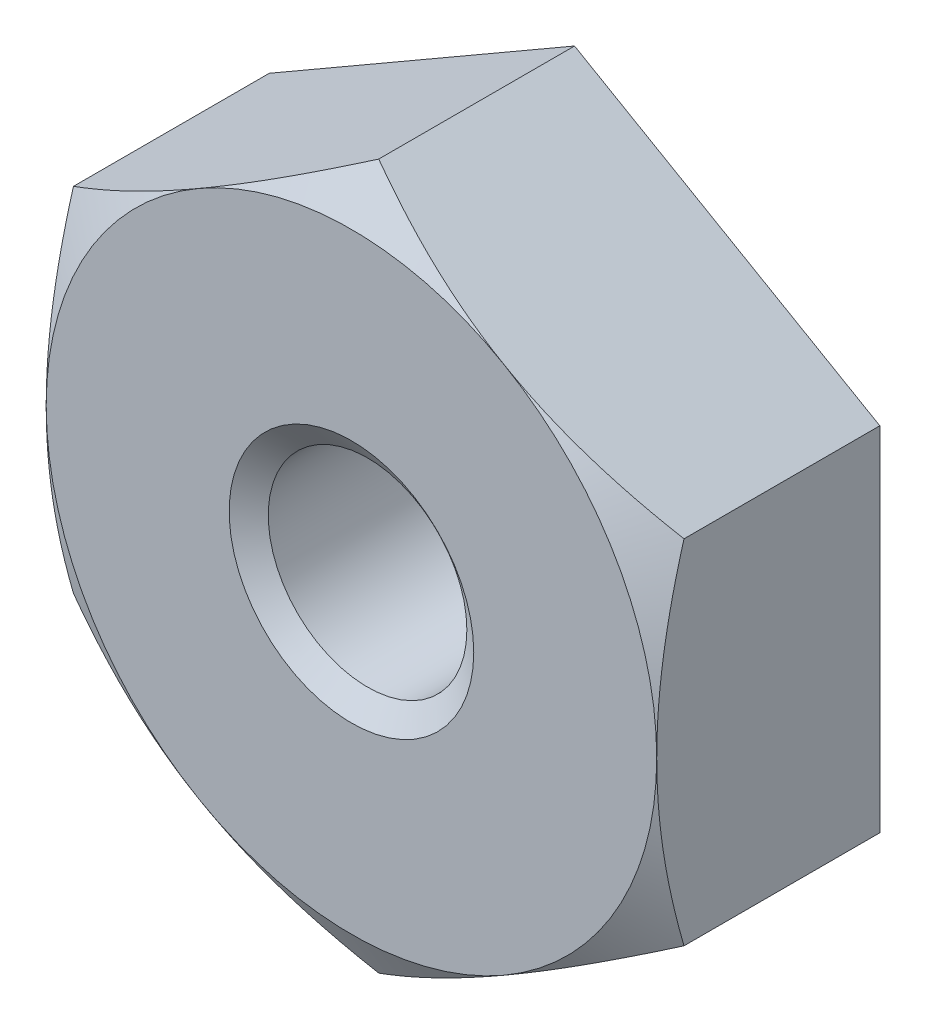
ISO-10303-21;
HEADER;
FILE_DESCRIPTION(('STEP AP214'),'2;1');
FILE_NAME('part.step','',(''),(''),'','','');
FILE_SCHEMA(('AUTOMOTIVE_DESIGN { 1 0 10303 214 1 1 1 1 }'));
ENDSEC;
DATA;
#1=APPLICATION_CONTEXT('core data for automotive mechanical design processes');
#2=APPLICATION_PROTOCOL_DEFINITION('international standard','automotive_design',2000,#1);
#3=PRODUCT_CONTEXT('',#1,'mechanical');
#4=PRODUCT('Part','Part','',(#3));
#5=PRODUCT_RELATED_PRODUCT_CATEGORY('part','',(#4));
#6=PRODUCT_DEFINITION_FORMATION('','',#4);
#7=PRODUCT_DEFINITION_CONTEXT('part definition',#1,'design');
#8=PRODUCT_DEFINITION('design','',#6,#7);
#9=PRODUCT_DEFINITION_SHAPE('','',#8);
#10=(LENGTH_UNIT() NAMED_UNIT(*) SI_UNIT(.MILLI.,.METRE.));
#11=(NAMED_UNIT(*) PLANE_ANGLE_UNIT() SI_UNIT($,.RADIAN.));
#12=(NAMED_UNIT(*) SI_UNIT($,.STERADIAN.) SOLID_ANGLE_UNIT());
#13=UNCERTAINTY_MEASURE_WITH_UNIT(LENGTH_MEASURE(1.E-05),#10,'distance_accuracy_value','');
#14=(GEOMETRIC_REPRESENTATION_CONTEXT(3) GLOBAL_UNCERTAINTY_ASSIGNED_CONTEXT((#13)) GLOBAL_UNIT_ASSIGNED_CONTEXT((#10,
#11,#12)) REPRESENTATION_CONTEXT('',''));
#15=CARTESIAN_POINT('',(0.,0.,0.));
#16=DIRECTION('',(0.,0.,1.));
#17=DIRECTION('',(1.,0.,0.));
#18=AXIS2_PLACEMENT_3D('',#15,#16,#17);
#19=CARTESIAN_POINT('',(0.,0.,0.));
#20=DIRECTION('',(0.,0.,1.));
#21=DIRECTION('',(1.,0.,0.));
#22=AXIS2_PLACEMENT_3D('',#19,#20,#21);
#23=CONICAL_SURFACE('',#22,1.58750000002783,0.959931088674871);
#24=CARTESIAN_POINT('',(0.,0.,-0.208976939778685));
#25=DIRECTION('',(0.,0.,1.));
#26=DIRECTION('',(1.,0.,0.));
#27=AXIS2_PLACEMENT_3D('',#24,#25,#26);
#28=CIRCLE('',#27,1.28905);
#29=CARTESIAN_POINT('',(1.28905,0.,-0.208976939778685));
#30=VERTEX_POINT('',#29);
#31=EDGE_CURVE('E100',#30,#30,#28,.F.);
#32=ORIENTED_EDGE('',*,*,#31,.T.);
#33=EDGE_LOOP('',(#32));
#34=FACE_BOUND('',#33,.T.);
#35=CARTESIAN_POINT('',(0.,0.,0.));
#36=DIRECTION('',(0.,0.,1.));
#37=DIRECTION('',(1.,0.,0.));
#38=AXIS2_PLACEMENT_3D('',#35,#36,#37);
#39=CIRCLE('',#38,1.58750000002783);
#40=CARTESIAN_POINT('',(1.58750000002783,0.,0.));
#41=VERTEX_POINT('',#40);
#42=EDGE_CURVE('E19',#41,#41,#39,.F.);
#43=ORIENTED_EDGE('',*,*,#42,.F.);
#44=EDGE_LOOP('',(#43));
#45=FACE_BOUND('',#44,.T.);
#46=ADVANCED_FACE('F16',(#34,#45),#23,.F.);
#47=CARTESIAN_POINT('',(-7.9248,0.,0.));
#48=DIRECTION('',(0.,0.,1.));
#49=DIRECTION('',(1.,0.,0.));
#50=AXIS2_PLACEMENT_3D('',#47,#48,#49);
#51=PLANE('',#50);
#52=ORIENTED_EDGE('',*,*,#42,.T.);
#53=EDGE_LOOP('',(#52));
#54=FACE_BOUND('',#53,.T.);
#55=CARTESIAN_POINT('',(0.,0.,-6.56372200515121E-11));
#56=DIRECTION('',(0.,0.,-1.));
#57=DIRECTION('',(-1.,0.,0.));
#58=AXIS2_PLACEMENT_3D('',#55,#56,#57);
#59=CIRCLE('',#58,3.96240000003445);
#60=CARTESIAN_POINT('',(-1.98120000000793,-3.43153905997078,-5.56949555088732E-11));
#61=VERTEX_POINT('',#60);
#62=CARTESIAN_POINT('',(-3.96240000001722,0.,-5.56924081194242E-11));
#63=VERTEX_POINT('',#62);
#64=EDGE_CURVE('E92',#61,#63,#59,.T.);
#65=ORIENTED_EDGE('',*,*,#64,.F.);
#66=CARTESIAN_POINT('',(0.,0.,-6.56372200515121E-11));
#67=DIRECTION('',(0.,0.,-1.));
#68=DIRECTION('',(-1.,0.,0.));
#69=AXIS2_PLACEMENT_3D('',#66,#67,#68);
#70=CIRCLE('',#69,3.96240000003445);
#71=CARTESIAN_POINT('',(1.98120000000831,-3.43153905997099,-5.59129998511057E-11));
#72=VERTEX_POINT('',#71);
#73=EDGE_CURVE('E85',#72,#61,#70,.T.);
#74=ORIENTED_EDGE('',*,*,#73,.F.);
#75=CARTESIAN_POINT('',(0.,0.,-6.56372200515121E-11));
#76=DIRECTION('',(0.,0.,-1.));
#77=DIRECTION('',(-1.,0.,0.));
#78=AXIS2_PLACEMENT_3D('',#75,#76,#77);
#79=CIRCLE('',#78,3.96240000003445);
#80=CARTESIAN_POINT('',(3.96240000001722,0.,-5.5692404785491E-11));
#81=VERTEX_POINT('',#80);
#82=EDGE_CURVE('E353',#81,#72,#79,.T.);
#83=ORIENTED_EDGE('',*,*,#82,.F.);
#84=CARTESIAN_POINT('',(0.,0.,-6.56372200515121E-11));
#85=DIRECTION('',(0.,0.,-1.));
#86=DIRECTION('',(-1.,0.,0.));
#87=AXIS2_PLACEMENT_3D('',#84,#85,#86);
#88=CIRCLE('',#87,3.96240000003445);
#89=CARTESIAN_POINT('',(1.98120000000812,3.43153905997067,-5.5694987124738E-11));
#90=VERTEX_POINT('',#89);
#91=EDGE_CURVE('E120',#90,#81,#88,.T.);
#92=ORIENTED_EDGE('',*,*,#91,.F.);
#93=CARTESIAN_POINT('',(0.,0.,-6.56372200515121E-11));
#94=DIRECTION('',(0.,0.,-1.));
#95=DIRECTION('',(-1.,0.,0.));
#96=AXIS2_PLACEMENT_3D('',#93,#94,#95);
#97=CIRCLE('',#96,3.96240000003445);
#98=CARTESIAN_POINT('',(-1.98120000000831,3.43153905997099,-5.59129872514906E-11));
#99=VERTEX_POINT('',#98);
#100=EDGE_CURVE('E115',#99,#90,#97,.T.);
#101=ORIENTED_EDGE('',*,*,#100,.F.);
#102=CARTESIAN_POINT('',(0.,0.,-6.56372200515121E-11));
#103=DIRECTION('',(0.,0.,-1.));
#104=DIRECTION('',(-1.,0.,0.));
#105=AXIS2_PLACEMENT_3D('',#102,#103,#104);
#106=CIRCLE('',#105,3.96240000003445);
#107=EDGE_CURVE('E112',#63,#99,#106,.T.);
#108=ORIENTED_EDGE('',*,*,#107,.F.);
#109=EDGE_LOOP('',(#65,#74,#83,#92,#101,#108));
#110=FACE_BOUND('',#109,.T.);
#111=ADVANCED_FACE('F113',(#54,#110),#51,.T.);
#112=CARTESIAN_POINT('',(0.,0.,-2.8956));
#113=DIRECTION('',(0.,0.,1.));
#114=DIRECTION('',(1.,0.,0.));
#115=AXIS2_PLACEMENT_3D('',#112,#113,#114);
#116=CYLINDRICAL_SURFACE('',#115,1.28905);
#117=ORIENTED_EDGE('',*,*,#31,.F.);
#118=EDGE_LOOP('',(#117));
#119=FACE_BOUND('',#118,.T.);
#120=CARTESIAN_POINT('',(0.,0.,-2.66122306027228));
#121=DIRECTION('',(0.,0.,-1.));
#122=DIRECTION('',(-1.,0.,0.));
#123=AXIS2_PLACEMENT_3D('',#120,#121,#122);
#124=CIRCLE('',#123,1.28905000002533);
#125=CARTESIAN_POINT('',(-1.28905000002533,0.,-2.66122306027228));
#126=VERTEX_POINT('',#125);
#127=EDGE_CURVE('E109',#126,#126,#124,.T.);
#128=ORIENTED_EDGE('',*,*,#127,.T.);
#129=EDGE_LOOP('',(#128));
#130=FACE_BOUND('',#129,.T.);
#131=ADVANCED_FACE('F296',(#119,#130),#116,.F.);
#132=CARTESIAN_POINT('',(0.,0.,-0.356030737123092));
#133=DIRECTION('',(0.,0.,-1.));
#134=DIRECTION('',(-1.,0.,0.));
#135=AXIS2_PLACEMENT_3D('',#132,#133,#134);
#136=CONICAL_SURFACE('',#135,4.57906332570701,1.04719755121967);
#137=CARTESIAN_POINT('',(-3.96240000000496,-2.28769270663065,-0.353907293384845));
#138=CARTESIAN_POINT('',(-3.96240000000173,-2.10147549503869,-0.300137528734297));
#139=CARTESIAN_POINT('',(-3.96240000000045,-1.91376698909865,-0.250875036768387));
#140=CARTESIAN_POINT('',(-3.96239999999955,-1.53669534529704,-0.16400151914846));
#141=CARTESIAN_POINT('',(-3.96239999999992,-1.34734536003443,-0.126332879527547));
#142=CARTESIAN_POINT('',(-3.96240000000004,-1.0615333778213,-0.0800821853820129));
#143=CARTESIAN_POINT('',(-3.96240000000001,-0.965901675388208,-0.0663683837050422));
#144=CARTESIAN_POINT('',(-3.96239999999999,-0.774180442581283,-0.0426295071316879));
#145=CARTESIAN_POINT('',(-3.9624,-0.678090924324954,-0.0326043351477672));
#146=CARTESIAN_POINT('',(-3.9624,-0.485098636635405,-0.0164188600612427));
#147=CARTESIAN_POINT('',(-3.9624,-0.388194206184148,-0.0102782114632332));
#148=CARTESIAN_POINT('',(-3.9624,-0.194194765652089,-0.00206028199634873));
#149=CARTESIAN_POINT('',(-3.9624,-0.0970997216374479,1.61941353962034E-05));
#150=CARTESIAN_POINT('',(-3.9624,0.,-4.57475961873363E-11));
#151=B_SPLINE_CURVE_WITH_KNOTS('',3,(#137,#138,#139,#140,#141,#142,#143,#144,#145,#146,#147,
#148,#149,#150),.UNSPECIFIED.,.F.,.F.,(4,2,2,2,2,2,4),(0.,0.581709371038443,1.16047952539474,
1.45024433628755,1.74000151980461,2.03121330078445,2.32248273808574),.UNSPECIFIED.);
#152=CARTESIAN_POINT('',(-3.9623999999969,-2.28769270663514,-0.353907293387842));
#153=VERTEX_POINT('',#152);
#154=EDGE_CURVE('E95',#153,#63,#151,.T.);
#155=ORIENTED_EDGE('',*,*,#154,.F.);
#156=CARTESIAN_POINT('',(-1.98119999999932,-3.43153905995586,-4.57525695276351E-11));
#157=CARTESIAN_POINT('',(-2.06529082563781,-3.3829891991371,1.61941354052637E-05));
#158=CARTESIAN_POINT('',(-2.14937760033611,-3.33444167712974,-0.00206028199633145));
#159=CARTESIAN_POINT('',(-2.31738604415696,-3.23744195686364,-0.0102782114632052));
#160=CARTESIAN_POINT('',(-2.40130774266707,-3.18898974163798,-0.0164188600612119));
#161=CARTESIAN_POINT('',(-2.56844396654078,-3.09249359779315,-0.0326043351477294));
#162=CARTESIAN_POINT('',(-2.65165993038821,-3.04444883866496,-0.0426295071316451));
#163=CARTESIAN_POINT('',(-2.81769538844396,-2.94858822226145,-0.0663683837050163));
#164=CARTESIAN_POINT('',(-2.90051487215821,-2.90077237104488,-0.0800821853820092));
#165=CARTESIAN_POINT('',(-3.14803530946095,-2.7578663799382,-0.126332879527492));
#166=CARTESIAN_POINT('',(-3.31201720690476,-2.66319138730679,-0.164001519148211));
#167=CARTESIAN_POINT('',(-3.63857082948386,-2.47465556540589,-0.250875036768773));
#168=CARTESIAN_POINT('',(-3.80113116413432,-2.38080131243589,-0.300137528735517));
#169=CARTESIAN_POINT('',(-3.96239999999456,-2.28769270664008,-0.353907293388092));
#170=B_SPLINE_CURVE_WITH_KNOTS('',3,(#156,#157,#158,#159,#160,#161,#162,#163,#164,#165,#166,
#167,#168,#169),.UNSPECIFIED.,.F.,.F.,(4,2,2,2,2,2,4),(0.,0.291269437301496,0.58248121828153,
0.872238401798723,1.16200321269168,1.74077336704842,2.32248273808741),.UNSPECIFIED.);
#171=EDGE_CURVE('E97',#61,#153,#170,.T.);
#172=ORIENTED_EDGE('',*,*,#171,.F.);
#173=ORIENTED_EDGE('',*,*,#64,.T.);
#174=EDGE_LOOP('',(#155,#172,#173));
#175=FACE_BOUND('',#174,.T.);
#176=ADVANCED_FACE('F94',(#175),#136,.T.);
#177=CARTESIAN_POINT('',(0.,0.,-0.356030737123092));
#178=DIRECTION('',(0.,0.,-1.));
#179=DIRECTION('',(-1.,0.,0.));
#180=AXIS2_PLACEMENT_3D('',#177,#178,#179);
#181=CONICAL_SURFACE('',#180,4.57906332570701,1.04719755121967);
#182=CARTESIAN_POINT('',(-7.69463730300368E-12,-4.57538541327565,-0.353907293384818));
#183=CARTESIAN_POINT('',(-0.161268835866518,-4.4822768074767,-0.300137528734392));
#184=CARTESIAN_POINT('',(-0.323829170516313,-4.38842255450551,-0.250875036768528));
#185=CARTESIAN_POINT('',(-0.650382793094741,-4.19988673260389,-0.164001519148621));
#186=CARTESIAN_POINT('',(-0.814364690538538,-4.10521173997293,-0.126332879527684));
#187=CARTESIAN_POINT('',(-1.06188512784112,-3.9623057488665,-0.0800821853821258));
#188=CARTESIAN_POINT('',(-1.14470461155531,-3.91448989764993,-0.066368383705149));
#189=CARTESIAN_POINT('',(-1.31074006961094,-3.81862928124646,-0.0426295071317791));
#190=CARTESIAN_POINT('',(-1.39395603345832,-3.7705845221183,-0.0326043351478487));
#191=CARTESIAN_POINT('',(-1.56109225733193,-3.67408837827354,-0.0164188600613044));
#192=CARTESIAN_POINT('',(-1.64501395584196,-3.62563616304792,-0.0102782114632846));
#193=CARTESIAN_POINT('',(-1.81302239966267,-3.5286364427819,-0.00206028199637828));
#194=CARTESIAN_POINT('',(-1.8971091743609,-3.48008892077458,1.61941353782464E-05));
#195=CARTESIAN_POINT('',(-1.98119999999932,-3.43153905995586,-4.57530039484424E-11));
#196=B_SPLINE_CURVE_WITH_KNOTS('',3,(#182,#183,#184,#185,#186,#187,#188,#189,#190,#191,#192,
#193,#194,#195),.UNSPECIFIED.,.F.,.F.,(4,2,2,2,2,2,4),(0.,0.58170937103836,1.16047952539459,
1.45024433628736,1.74000151980438,2.03121330078419,2.32248273808544),.UNSPECIFIED.);
#197=CARTESIAN_POINT('',(3.37195145828454E-13,-4.57538541327087,-0.353907293388142));
#198=VERTEX_POINT('',#197);
#199=EDGE_CURVE('E124',#198,#61,#196,.T.);
#200=ORIENTED_EDGE('',*,*,#199,.F.);
#201=CARTESIAN_POINT('',(1.98119999999989,-3.43153905995641,-4.61886142309622E-11));
#202=CARTESIAN_POINT('',(1.89710917436145,-3.48008892077514,1.61941349479911E-05));
#203=CARTESIAN_POINT('',(1.81302239966319,-3.52863644278247,-0.00206028199680745));
#204=CARTESIAN_POINT('',(1.64501395584244,-3.62563616304851,-0.010278211463713));
#205=CARTESIAN_POINT('',(1.56109225733238,-3.67408837827415,-0.0164188600617328));
#206=CARTESIAN_POINT('',(1.39395603345876,-3.77058452211893,-0.0326043351482699));
#207=CARTESIAN_POINT('',(1.31074006961138,-3.81862928124709,-0.0426295071321924));
#208=CARTESIAN_POINT('',(1.14470461155573,-3.91448989765055,-0.0663683837055722));
#209=CARTESIAN_POINT('',(1.06188512784152,-3.96230574886709,-0.080082185382567));
#210=CARTESIAN_POINT('',(0.814364690538925,-4.10521173997368,-0.126332879528048));
#211=CARTESIAN_POINT('',(0.650382793095213,-4.19988673260504,-0.164001519148754));
#212=CARTESIAN_POINT('',(0.323829170516298,-4.38842255450583,-0.250875036769275));
#213=CARTESIAN_POINT('',(0.161268835865927,-4.48227680747578,-0.30013752873599));
#214=CARTESIAN_POINT('',(5.77978009311843E-12,-4.57538541327154,-0.353907293388532));
#215=B_SPLINE_CURVE_WITH_KNOTS('',3,(#201,#202,#203,#204,#205,#206,#207,#208,#209,#210,#211,
#212,#213,#214),.UNSPECIFIED.,.F.,.F.,(4,2,2,2,2,2,4),(0.,0.29126943730133,0.5824812182812,
0.872238401798231,1.16200321269103,1.74077336704745,2.3224827380861),.UNSPECIFIED.);
#216=EDGE_CURVE('E220',#72,#198,#215,.T.);
#217=ORIENTED_EDGE('',*,*,#216,.F.);
#218=ORIENTED_EDGE('',*,*,#73,.T.);
#219=EDGE_LOOP('',(#200,#217,#218));
#220=FACE_BOUND('',#219,.T.);
#221=ADVANCED_FACE('F210',(#220),#181,.T.);
#222=CARTESIAN_POINT('',(0.,0.,-0.356030737123092));
#223=DIRECTION('',(0.,0.,-1.));
#224=DIRECTION('',(-1.,0.,0.));
#225=AXIS2_PLACEMENT_3D('',#222,#223,#224);
#226=CONICAL_SURFACE('',#225,4.57906332570701,1.04719755121967);
#227=ORIENTED_EDGE('',*,*,#82,.T.);
#228=CARTESIAN_POINT('',(3.96239999999708,-2.28769270664515,-0.353907293385162));
#229=CARTESIAN_POINT('',(3.80113116413494,-2.38080131243838,-0.300137528734596));
#230=CARTESIAN_POINT('',(3.6385708294838,-2.47465556540731,-0.250875036768686));
#231=CARTESIAN_POINT('',(3.31201720690436,-2.66319138730738,-0.164001519148772));
#232=CARTESIAN_POINT('',(3.14803530946089,-2.75786637993901,-0.126332879527874));
#233=CARTESIAN_POINT('',(2.90051487215836,-2.90077237104571,-0.0800821853823622));
#234=CARTESIAN_POINT('',(2.81769538844413,-2.94858822226224,-0.0663683837053986));
#235=CARTESIAN_POINT('',(2.65165993038843,-3.0444488386657,-0.0426295071320597));
#236=CARTESIAN_POINT('',(2.56844396654103,-3.09249359779387,-0.0326043351481473));
#237=CARTESIAN_POINT('',(2.40130774266739,-3.18898974163867,-0.0164188600616396));
#238=CARTESIAN_POINT('',(2.31738604415733,-3.2374419568643,-0.0102782114636386));
#239=CARTESIAN_POINT('',(2.14937760033658,-3.33444167713035,-0.00206028199677154));
#240=CARTESIAN_POINT('',(2.06529082563832,-3.38298919913767,1.61941349644391E-05));
#241=CARTESIAN_POINT('',(1.98119999999989,-3.43153905995641,-4.61887796506993E-11));
#242=B_SPLINE_CURVE_WITH_KNOTS('',3,(#228,#229,#230,#231,#232,#233,#234,#235,#236,#237,#238,
#239,#240,#241),.UNSPECIFIED.,.F.,.F.,(4,2,2,2,2,2,4),(0.,0.581709371038513,1.16047952539488,
1.45024433628772,1.74000151980481,2.03121330078469,2.32248273808601),.UNSPECIFIED.);
#243=CARTESIAN_POINT('',(3.96239999999695,-2.28769270663584,-0.353907293388065));
#244=VERTEX_POINT('',#243);
#245=EDGE_CURVE('E215',#244,#72,#242,.T.);
#246=ORIENTED_EDGE('',*,*,#245,.F.);
#247=CARTESIAN_POINT('',(3.9624,-2.28769270663035,-0.353907293388007));
#248=CARTESIAN_POINT('',(3.9624,-2.10147549503883,-0.300137528735463));
#249=CARTESIAN_POINT('',(3.9624,-1.91376698909892,-0.250875036768746));
#250=CARTESIAN_POINT('',(3.9624,-1.53669534529732,-0.164001519148228));
#251=CARTESIAN_POINT('',(3.9624,-1.3473453600346,-0.126332879527525));
#252=CARTESIAN_POINT('',(3.9624,-1.0615333778214,-0.0800821853820539));
#253=CARTESIAN_POINT('',(3.9624,-0.96590167538831,-0.0663683837050633));
#254=CARTESIAN_POINT('',(3.9624,-0.774180442581389,-0.042629507131693));
#255=CARTESIAN_POINT('',(3.9624,-0.67809092432506,-0.032604335147776));
#256=CARTESIAN_POINT('',(3.9624,-0.485098636635498,-0.0164188600612514));
#257=CARTESIAN_POINT('',(3.9624,-0.388194206184227,-0.0102782114632389));
#258=CARTESIAN_POINT('',(3.9624,-0.194194765652131,-0.00206028199634893));
#259=CARTESIAN_POINT('',(3.9624,-0.0970997216374687,1.61941353980119E-05));
#260=CARTESIAN_POINT('',(3.9624,0.,-4.57476166220059E-11));
#261=B_SPLINE_CURVE_WITH_KNOTS('',3,(#247,#248,#249,#250,#251,#252,#253,#254,#255,#256,#257,
#258,#259,#260),.UNSPECIFIED.,.F.,.F.,(4,2,2,2,2,2,4),(0.,0.58170937103869,1.16047952539515,
1.45024433628796,1.74000151980501,2.0312133007849,2.32248273808625),.UNSPECIFIED.);
#262=EDGE_CURVE('E195',#244,#81,#261,.T.);
#263=ORIENTED_EDGE('',*,*,#262,.T.);
#264=EDGE_LOOP('',(#227,#246,#263));
#265=FACE_BOUND('',#264,.T.);
#266=ADVANCED_FACE('F207',(#265),#226,.T.);
#267=CARTESIAN_POINT('',(0.,0.,-0.356030737123092));
#268=DIRECTION('',(0.,0.,-1.));
#269=DIRECTION('',(-1.,0.,0.));
#270=AXIS2_PLACEMENT_3D('',#267,#268,#269);
#271=CONICAL_SURFACE('',#270,4.57906332570701,1.04719755121967);
#272=CARTESIAN_POINT('',(3.9624,0.,-4.574758951947E-11));
#273=CARTESIAN_POINT('',(3.9624,0.0970997216374445,1.61941353983636E-05));
#274=CARTESIAN_POINT('',(3.9624,0.194194765652082,-0.00206028199634748));
#275=CARTESIAN_POINT('',(3.9624,0.388194206184128,-0.0102782114632333));
#276=CARTESIAN_POINT('',(3.9624,0.485098636635375,-0.0164188600612429));
#277=CARTESIAN_POINT('',(3.9624,0.678090924324888,-0.0326043351477594));
#278=CARTESIAN_POINT('',(3.9624,0.774180442581192,-0.0426295071316713));
#279=CARTESIAN_POINT('',(3.9624,0.965901675388065,-0.0663683837050298));
#280=CARTESIAN_POINT('',(3.9624,1.06153337782113,-0.0800821853820138));
#281=CARTESIAN_POINT('',(3.9624,1.34734536003426,-0.126332879527463));
#282=CARTESIAN_POINT('',(3.9624,1.53669534529693,-0.164001519148148));
#283=CARTESIAN_POINT('',(3.9624,1.91376698909844,-0.250875036768626));
#284=CARTESIAN_POINT('',(3.9624,2.1014754950383,-0.300137528735321));
#285=CARTESIAN_POINT('',(3.9624,2.28769270662978,-0.353907293387842));
#286=B_SPLINE_CURVE_WITH_KNOTS('',3,(#272,#273,#274,#275,#276,#277,#278,#279,#280,#281,#282,
#283,#284,#285),.UNSPECIFIED.,.F.,.F.,(4,2,2,2,2,2,4),(0.,0.291269437301274,0.582481218281088,
0.872238401798063,1.1620032126908,1.74077336704711,2.32248273808565),.UNSPECIFIED.);
#287=CARTESIAN_POINT('',(3.9623999999969,2.28769270663514,-0.353907293387843));
#288=VERTEX_POINT('',#287);
#289=EDGE_CURVE('E202',#81,#288,#286,.T.);
#290=ORIENTED_EDGE('',*,*,#289,.T.);
#291=CARTESIAN_POINT('',(1.98119999999951,3.43153905995575,-4.57528199134023E-11));
#292=CARTESIAN_POINT('',(2.06529082563799,3.382989199137,1.61941354022914E-05));
#293=CARTESIAN_POINT('',(2.14937760033629,3.33444167712964,-0.00206028199633709));
#294=CARTESIAN_POINT('',(2.31738604415712,3.23744195686355,-0.0102782114632155));
#295=CARTESIAN_POINT('',(2.40130774266722,3.1889897416379,-0.0164188600612242));
#296=CARTESIAN_POINT('',(2.56844396654092,3.09249359779307,-0.0326043351477442));
#297=CARTESIAN_POINT('',(2.65165993038834,3.04444883866489,-0.0426295071316606));
#298=CARTESIAN_POINT('',(2.81769538844407,2.94858822226138,-0.0663683837050332));
#299=CARTESIAN_POINT('',(2.90051487215831,2.90077237104482,-0.0800821853820267));
#300=CARTESIAN_POINT('',(3.14803530946103,2.75786637993815,-0.12633287952751));
#301=CARTESIAN_POINT('',(3.31201720690482,2.66319138730675,-0.164001519148227));
#302=CARTESIAN_POINT('',(3.63857082948389,2.47465556540587,-0.250875036768782));
#303=CARTESIAN_POINT('',(3.80113116413433,2.38080131243588,-0.300137528735521));
#304=CARTESIAN_POINT('',(3.96239999999455,2.28769270664008,-0.353907293388092));
#305=B_SPLINE_CURVE_WITH_KNOTS('',3,(#291,#292,#293,#294,#295,#296,#297,#298,#299,#300,#301,
#302,#303,#304),.UNSPECIFIED.,.F.,.F.,(4,2,2,2,2,2,4),(0.,0.291269437301468,0.582481218281474,
0.87223840179864,1.16200321269157,1.74077336704826,2.32248273808719),.UNSPECIFIED.);
#306=EDGE_CURVE('E167',#90,#288,#305,.T.);
#307=ORIENTED_EDGE('',*,*,#306,.F.);
#308=ORIENTED_EDGE('',*,*,#91,.T.);
#309=EDGE_LOOP('',(#290,#307,#308));
#310=FACE_BOUND('',#309,.T.);
#311=ADVANCED_FACE('F150',(#310),#271,.T.);
#312=CARTESIAN_POINT('',(0.,0.,-0.356030737123092));
#313=DIRECTION('',(0.,0.,-1.));
#314=DIRECTION('',(-1.,0.,0.));
#315=AXIS2_PLACEMENT_3D('',#312,#313,#314);
#316=CONICAL_SURFACE('',#315,4.57906332570701,1.04719755121967);
#317=ORIENTED_EDGE('',*,*,#107,.T.);
#318=CARTESIAN_POINT('',(-3.96239999999711,2.28769270664518,-0.353907293385135));
#319=CARTESIAN_POINT('',(-3.80113116413495,2.38080131243839,-0.300137528734587));
#320=CARTESIAN_POINT('',(-3.6385708294838,2.47465556540732,-0.250875036768684));
#321=CARTESIAN_POINT('',(-3.31201720690435,2.66319138730737,-0.164001519148775));
#322=CARTESIAN_POINT('',(-3.14803530946089,2.75786637993901,-0.126332879527875));
#323=CARTESIAN_POINT('',(-2.90051487215836,2.90077237104571,-0.0800821853823619));
#324=CARTESIAN_POINT('',(-2.81769538844413,2.94858822226224,-0.0663683837053983));
#325=CARTESIAN_POINT('',(-2.65165993038843,3.0444488386657,-0.0426295071320596));
#326=CARTESIAN_POINT('',(-2.56844396654103,3.09249359779387,-0.0326043351481472));
#327=CARTESIAN_POINT('',(-2.40130774266739,3.18898974163867,-0.0164188600616397));
#328=CARTESIAN_POINT('',(-2.31738604415733,3.2374419568643,-0.010278211463639));
#329=CARTESIAN_POINT('',(-2.14937760033658,3.33444167713035,-0.00206028199677205));
#330=CARTESIAN_POINT('',(-2.06529082563832,3.38298919913767,1.61941349639922E-05));
#331=CARTESIAN_POINT('',(-1.98119999999989,3.43153905995641,-4.61887544514691E-11));
#332=B_SPLINE_CURVE_WITH_KNOTS('',3,(#318,#319,#320,#321,#322,#323,#324,#325,#326,#327,#328,
#329,#330,#331),.UNSPECIFIED.,.F.,.F.,(4,2,2,2,2,2,4),(0.,0.581709371038512,1.16047952539488,
1.45024433628772,1.74000151980481,2.03121330078469,2.32248273808601),.UNSPECIFIED.);
#333=CARTESIAN_POINT('',(-3.96240000000008,2.28769270663406,-0.353907293389117));
#334=VERTEX_POINT('',#333);
#335=EDGE_CURVE('E123',#334,#99,#332,.T.);
#336=ORIENTED_EDGE('',*,*,#335,.F.);
#337=CARTESIAN_POINT('',(-3.9624,0.,-4.574758951947E-11));
#338=CARTESIAN_POINT('',(-3.9624,0.0970997216375098,1.61941353979124E-05));
#339=CARTESIAN_POINT('',(-3.9624,0.194194765652213,-0.00206028199635063));
#340=CARTESIAN_POINT('',(-3.9624,0.38819420618439,-0.0102782114632471));
#341=CARTESIAN_POINT('',(-3.9624,0.485098636635702,-0.0164188600612646));
#342=CARTESIAN_POINT('',(-3.9624,0.678090924325344,-0.0326043351478027));
#343=CARTESIAN_POINT('',(-3.9624,0.774180442581712,-0.0426295071317283));
#344=CARTESIAN_POINT('',(-3.9624,0.965901675388713,-0.0663683837051181));
#345=CARTESIAN_POINT('',(-3.9624,1.06153337782184,-0.0800821853821195));
#346=CARTESIAN_POINT('',(-3.9624,1.34734536003516,-0.126332879527627));
#347=CARTESIAN_POINT('',(-3.9624,1.53669534529795,-0.164001519148359));
#348=CARTESIAN_POINT('',(-3.9624,1.9137669890997,-0.250875036768942));
#349=CARTESIAN_POINT('',(-3.9624,2.10147549503969,-0.300137528735694));
#350=CARTESIAN_POINT('',(-3.9624,2.28769270663128,-0.353907293388276));
#351=B_SPLINE_CURVE_WITH_KNOTS('',3,(#337,#338,#339,#340,#341,#342,#343,#344,#345,#346,#347,
#348,#349,#350),.UNSPECIFIED.,.F.,.F.,(4,2,2,2,2,2,4),(0.,0.291269437301471,0.582481218281482,
0.872238401798651,1.16200321269159,1.74077336704828,2.32248273808722),.UNSPECIFIED.);
#352=EDGE_CURVE('E105',#63,#334,#351,.T.);
#353=ORIENTED_EDGE('',*,*,#352,.F.);
#354=EDGE_LOOP('',(#317,#336,#353));
#355=FACE_BOUND('',#354,.T.);
#356=ADVANCED_FACE('F122',(#355),#316,.T.);
#357=CARTESIAN_POINT('',(0.,0.,-0.356030737123092));
#358=DIRECTION('',(0.,0.,-1.));
#359=DIRECTION('',(-1.,0.,0.));
#360=AXIS2_PLACEMENT_3D('',#357,#358,#359);
#361=CONICAL_SURFACE('',#360,4.57906332570701,1.04719755121967);
#362=CARTESIAN_POINT('',(7.69461387385217E-12,4.57538541327565,-0.353907293384817));
#363=CARTESIAN_POINT('',(0.161268835866533,4.48227680747669,-0.300137528734386));
#364=CARTESIAN_POINT('',(0.323829170516344,4.38842255450549,-0.250875036768518));
#365=CARTESIAN_POINT('',(0.650382793094803,4.19988673260385,-0.164001519148605));
#366=CARTESIAN_POINT('',(0.814364690538616,4.10521173997289,-0.126332879527667));
#367=CARTESIAN_POINT('',(1.06188512784122,3.96230574886644,-0.0800821853821083));
#368=CARTESIAN_POINT('',(1.14470461155542,3.91448989764987,-0.0663683837051314));
#369=CARTESIAN_POINT('',(1.31074006961107,3.81862928124638,-0.0426295071317626));
#370=CARTESIAN_POINT('',(1.39395603345846,3.77058452211823,-0.0326043351478336));
#371=CARTESIAN_POINT('',(1.56109225733208,3.67408837827346,-0.0164188600612923));
#372=CARTESIAN_POINT('',(1.64501395584212,3.62563616304783,-0.0102782114632743));
#373=CARTESIAN_POINT('',(1.81302239966284,3.52863644278179,-0.00206028199637226));
#374=CARTESIAN_POINT('',(1.89710917436109,3.48008892077447,1.61941353817016E-05));
#375=CARTESIAN_POINT('',(1.98119999999951,3.43153905995575,-4.57527541979639E-11));
#376=B_SPLINE_CURVE_WITH_KNOTS('',3,(#362,#363,#364,#365,#366,#367,#368,#369,#370,#371,#372,
#373,#374,#375),.UNSPECIFIED.,.F.,.F.,(4,2,2,2,2,2,4),(0.,0.581709371038415,1.1604795253947,
1.4502443362875,1.74000151980455,2.03121330078438,2.32248273808566),.UNSPECIFIED.);
#377=CARTESIAN_POINT('',(-3.37075709342222E-13,4.57538541327087,-0.353907293388142));
#378=VERTEX_POINT('',#377);
#379=EDGE_CURVE('E189',#378,#90,#376,.T.);
#380=ORIENTED_EDGE('',*,*,#379,.F.);
#381=CARTESIAN_POINT('',(-1.98119999999989,3.43153905995641,-4.61886142309622E-11));
#382=CARTESIAN_POINT('',(-1.89710917436145,3.48008892077514,1.61941349479911E-05));
#383=CARTESIAN_POINT('',(-1.81302239966319,3.52863644278247,-0.00206028199680745));
#384=CARTESIAN_POINT('',(-1.64501395584244,3.62563616304851,-0.010278211463713));
#385=CARTESIAN_POINT('',(-1.56109225733238,3.67408837827415,-0.0164188600617328));
#386=CARTESIAN_POINT('',(-1.39395603345876,3.77058452211893,-0.0326043351482699));
#387=CARTESIAN_POINT('',(-1.31074006961138,3.81862928124709,-0.0426295071321924));
#388=CARTESIAN_POINT('',(-1.14470461155573,3.91448989765055,-0.0663683837055722));
#389=CARTESIAN_POINT('',(-1.06188512784152,3.96230574886709,-0.080082185382567));
#390=CARTESIAN_POINT('',(-0.814364690538925,4.10521173997368,-0.126332879528048));
#391=CARTESIAN_POINT('',(-0.650382793095213,4.19988673260504,-0.164001519148754));
#392=CARTESIAN_POINT('',(-0.323829170516298,4.38842255450583,-0.250875036769275));
#393=CARTESIAN_POINT('',(-0.161268835865927,4.48227680747578,-0.30013752873599));
#394=CARTESIAN_POINT('',(-5.77978009311843E-12,4.57538541327154,-0.353907293388532));
#395=B_SPLINE_CURVE_WITH_KNOTS('',3,(#381,#382,#383,#384,#385,#386,#387,#388,#389,#390,#391,
#392,#393,#394),.UNSPECIFIED.,.F.,.F.,(4,2,2,2,2,2,4),(0.,0.29126943730133,0.5824812182812,
0.872238401798231,1.16200321269103,1.74077336704745,2.3224827380861),.UNSPECIFIED.);
#396=EDGE_CURVE('E162',#99,#378,#395,.T.);
#397=ORIENTED_EDGE('',*,*,#396,.F.);
#398=ORIENTED_EDGE('',*,*,#100,.T.);
#399=EDGE_LOOP('',(#380,#397,#398));
#400=FACE_BOUND('',#399,.T.);
#401=ADVANCED_FACE('F149',(#400),#361,.T.);
#402=CARTESIAN_POINT('',(0.,0.,-2.87020000001803));
#403=DIRECTION('',(0.,0.,-1.));
#404=DIRECTION('',(-1.,0.,0.));
#405=AXIS2_PLACEMENT_3D('',#402,#403,#404);
#406=CONICAL_SURFACE('',#405,1.58750000002783,0.959931088674871);
#407=CARTESIAN_POINT('',(0.,0.,-2.8702));
#408=DIRECTION('',(0.,0.,1.));
#409=DIRECTION('',(1.,0.,0.));
#410=AXIS2_PLACEMENT_3D('',#407,#408,#409);
#411=CIRCLE('',#410,1.5875);
#412=CARTESIAN_POINT('',(1.5875,0.,-2.8702));
#413=VERTEX_POINT('',#412);
#414=EDGE_CURVE('E332',#413,#413,#411,.F.);
#415=ORIENTED_EDGE('',*,*,#414,.T.);
#416=EDGE_LOOP('',(#415));
#417=FACE_BOUND('',#416,.T.);
#418=ORIENTED_EDGE('',*,*,#127,.F.);
#419=EDGE_LOOP('',(#418));
#420=FACE_BOUND('',#419,.T.);
#421=ADVANCED_FACE('F241',(#417,#420),#406,.F.);
#422=CARTESIAN_POINT('',(-3.9624,2.28769270663693,-2.8956));
#423=DIRECTION('',(-1.,0.,0.));
#424=DIRECTION('',(0.,0.,1.));
#425=AXIS2_PLACEMENT_3D('',#422,#423,#424);
#426=PLANE('',#425);
#427=DIRECTION('',(0.,0.,1.));
#428=VECTOR('',#427,1.);
#429=CARTESIAN_POINT('',(-3.96240000000016,2.28769270663771,-2.8956));
#430=LINE('',#429,#428);
#431=CARTESIAN_POINT('',(-3.96240000000008,2.28769270663758,-2.8956));
#432=VERTEX_POINT('',#431);
#433=EDGE_CURVE('E163',#432,#334,#430,.T.);
#434=ORIENTED_EDGE('',*,*,#433,.F.);
#435=DIRECTION('',(0.,1.,0.));
#436=VECTOR('',#435,1.);
#437=CARTESIAN_POINT('',(-3.9624,0.,-2.8956));
#438=LINE('',#437,#436);
#439=CARTESIAN_POINT('',(-3.96240000000001,-2.28769270663707,-2.8956));
#440=VERTEX_POINT('',#439);
#441=EDGE_CURVE('E280',#432,#440,#438,.F.);
#442=ORIENTED_EDGE('',*,*,#441,.T.);
#443=DIRECTION('',(0.,0.,1.));
#444=VECTOR('',#443,1.);
#445=CARTESIAN_POINT('',(-3.9624,-2.28769270663693,-2.8956));
#446=LINE('',#445,#444);
#447=EDGE_CURVE('E108',#153,#440,#446,.F.);
#448=ORIENTED_EDGE('',*,*,#447,.F.);
#449=ORIENTED_EDGE('',*,*,#154,.T.);
#450=ORIENTED_EDGE('',*,*,#352,.T.);
#451=EDGE_LOOP('',(#434,#442,#448,#449,#450));
#452=FACE_BOUND('',#451,.T.);
#453=ADVANCED_FACE('F103',(#452),#426,.T.);
#454=CARTESIAN_POINT('',(-3.9624,-2.28769270663693,-2.8956));
#455=DIRECTION('',(-0.500000000000017,-0.866025403784429,0.));
#456=DIRECTION('',(0.866025403784429,-0.500000000000017,0.));
#457=AXIS2_PLACEMENT_3D('',#454,#455,#456);
#458=PLANE('',#457);
#459=ORIENTED_EDGE('',*,*,#447,.T.);
#460=DIRECTION('',(0.86602540378437,-0.500000000000118,0.));
#461=VECTOR('',#460,1.);
#462=CARTESIAN_POINT('',(-3.9624,-2.28769270663719,-2.8956));
#463=LINE('',#462,#461);
#464=CARTESIAN_POINT('',(1.41660016423042E-13,-4.5753854132748,-2.8956));
#465=VERTEX_POINT('',#464);
#466=EDGE_CURVE('E268',#440,#465,#463,.T.);
#467=ORIENTED_EDGE('',*,*,#466,.T.);
#468=DIRECTION('',(0.,0.,1.));
#469=VECTOR('',#468,1.);
#470=CARTESIAN_POINT('',(0.,-4.57538541327488,-2.8956));
#471=LINE('',#470,#469);
#472=EDGE_CURVE('E311',#198,#465,#471,.F.);
#473=ORIENTED_EDGE('',*,*,#472,.F.);
#474=ORIENTED_EDGE('',*,*,#199,.T.);
#475=ORIENTED_EDGE('',*,*,#171,.T.);
#476=EDGE_LOOP('',(#459,#467,#473,#474,#475));
#477=FACE_BOUND('',#476,.T.);
#478=ADVANCED_FACE('F230',(#477),#458,.T.);
#479=CARTESIAN_POINT('',(0.,-4.57538541327488,-2.8956));
#480=DIRECTION('',(0.500000000000017,-0.866025403784429,0.));
#481=DIRECTION('',(0.866025403784429,0.500000000000017,0.));
#482=AXIS2_PLACEMENT_3D('',#479,#480,#481);
#483=PLANE('',#482);
#484=ORIENTED_EDGE('',*,*,#472,.T.);
#485=DIRECTION('',(0.866025403784395,0.500000000000077,0.));
#486=VECTOR('',#485,1.);
#487=CARTESIAN_POINT('',(0.,-4.57538541327488,-2.8956));
#488=LINE('',#487,#486);
#489=CARTESIAN_POINT('',(3.9624,-2.28769270663751,-2.8956));
#490=VERTEX_POINT('',#489);
#491=EDGE_CURVE('E266',#465,#490,#488,.T.);
#492=ORIENTED_EDGE('',*,*,#491,.T.);
#493=DIRECTION('',(0.,0.,1.));
#494=VECTOR('',#493,1.);
#495=CARTESIAN_POINT('',(3.9624,-2.28769270663744,-2.8956));
#496=LINE('',#495,#494);
#497=EDGE_CURVE('E201',#490,#244,#496,.T.);
#498=ORIENTED_EDGE('',*,*,#497,.T.);
#499=ORIENTED_EDGE('',*,*,#245,.T.);
#500=ORIENTED_EDGE('',*,*,#216,.T.);
#501=EDGE_LOOP('',(#484,#492,#498,#499,#500));
#502=FACE_BOUND('',#501,.T.);
#503=ADVANCED_FACE('F227',(#502),#483,.T.);
#504=CARTESIAN_POINT('',(3.9624,2.28769270663693,-2.8956));
#505=DIRECTION('',(-1.,0.,0.));
#506=DIRECTION('',(0.,0.,1.));
#507=AXIS2_PLACEMENT_3D('',#504,#505,#506);
#508=PLANE('',#507);
#509=ORIENTED_EDGE('',*,*,#497,.F.);
#510=DIRECTION('',(0.,1.,0.));
#511=VECTOR('',#510,1.);
#512=CARTESIAN_POINT('',(3.9624,0.,-2.8956));
#513=LINE('',#512,#511);
#514=CARTESIAN_POINT('',(3.9624,2.28769270663693,-2.8956));
#515=VERTEX_POINT('',#514);
#516=EDGE_CURVE('E257',#490,#515,#513,.T.);
#517=ORIENTED_EDGE('',*,*,#516,.T.);
#518=DIRECTION('',(0.,0.,1.));
#519=VECTOR('',#518,1.);
#520=CARTESIAN_POINT('',(3.9624,2.28769270663693,-2.8956));
#521=LINE('',#520,#519);
#522=EDGE_CURVE('E263',#288,#515,#521,.F.);
#523=ORIENTED_EDGE('',*,*,#522,.F.);
#524=ORIENTED_EDGE('',*,*,#289,.F.);
#525=ORIENTED_EDGE('',*,*,#262,.F.);
#526=EDGE_LOOP('',(#509,#517,#523,#524,#525));
#527=FACE_BOUND('',#526,.T.);
#528=ADVANCED_FACE('F184',(#527),#508,.F.);
#529=CARTESIAN_POINT('',(3.9624,2.28769270663693,-2.8956));
#530=DIRECTION('',(0.500000000000017,0.866025403784429,0.));
#531=DIRECTION('',(-0.866025403784429,0.500000000000017,0.));
#532=AXIS2_PLACEMENT_3D('',#529,#530,#531);
#533=PLANE('',#532);
#534=ORIENTED_EDGE('',*,*,#522,.T.);
#535=DIRECTION('',(-0.866025403784346,0.50000000000016,0.));
#536=VECTOR('',#535,1.);
#537=CARTESIAN_POINT('',(3.9624,2.28769270663693,-2.8956));
#538=LINE('',#537,#536);
#539=CARTESIAN_POINT('',(0.,4.57538541327488,-2.8956));
#540=VERTEX_POINT('',#539);
#541=EDGE_CURVE('E254',#515,#540,#538,.T.);
#542=ORIENTED_EDGE('',*,*,#541,.T.);
#543=DIRECTION('',(0.,0.,1.));
#544=VECTOR('',#543,1.);
#545=CARTESIAN_POINT('',(0.,4.57538541327488,-2.8956));
#546=LINE('',#545,#544);
#547=EDGE_CURVE('E34',#378,#540,#546,.F.);
#548=ORIENTED_EDGE('',*,*,#547,.F.);
#549=ORIENTED_EDGE('',*,*,#379,.T.);
#550=ORIENTED_EDGE('',*,*,#306,.T.);
#551=EDGE_LOOP('',(#534,#542,#548,#549,#550));
#552=FACE_BOUND('',#551,.T.);
#553=ADVANCED_FACE('F178',(#552),#533,.T.);
#554=CARTESIAN_POINT('',(0.,4.57538541327488,-2.8956));
#555=DIRECTION('',(-0.500000000000017,0.866025403784429,0.));
#556=DIRECTION('',(-0.866025403784429,-0.500000000000017,0.));
#557=AXIS2_PLACEMENT_3D('',#554,#555,#556);
#558=PLANE('',#557);
#559=ORIENTED_EDGE('',*,*,#547,.T.);
#560=DIRECTION('',(-0.866025403784395,-0.500000000000077,0.));
#561=VECTOR('',#560,1.);
#562=CARTESIAN_POINT('',(0.,4.57538541327488,-2.8956));
#563=LINE('',#562,#561);
#564=EDGE_CURVE('E25',#540,#432,#563,.T.);
#565=ORIENTED_EDGE('',*,*,#564,.T.);
#566=ORIENTED_EDGE('',*,*,#433,.T.);
#567=ORIENTED_EDGE('',*,*,#335,.T.);
#568=ORIENTED_EDGE('',*,*,#396,.T.);
#569=EDGE_LOOP('',(#559,#565,#566,#567,#568));
#570=FACE_BOUND('',#569,.T.);
#571=ADVANCED_FACE('F173',(#570),#558,.T.);
#572=CARTESIAN_POINT('',(0.,0.,-25.0375057290921));
#573=DIRECTION('',(0.,0.,1.));
#574=DIRECTION('',(1.,0.,0.));
#575=AXIS2_PLACEMENT_3D('',#572,#573,#574);
#576=CYLINDRICAL_SURFACE('',#575,1.5875);
#577=CARTESIAN_POINT('',(0.,0.,-2.8956));
#578=DIRECTION('',(0.,0.,1.));
#579=DIRECTION('',(1.,0.,0.));
#580=AXIS2_PLACEMENT_3D('',#577,#578,#579);
#581=CIRCLE('',#580,1.5875);
#582=CARTESIAN_POINT('',(1.5875,0.,-2.8956));
#583=VERTEX_POINT('',#582);
#584=EDGE_CURVE('E11',#583,#583,#581,.F.);
#585=ORIENTED_EDGE('',*,*,#584,.T.);
#586=EDGE_LOOP('',(#585));
#587=FACE_BOUND('',#586,.T.);
#588=ORIENTED_EDGE('',*,*,#414,.F.);
#589=EDGE_LOOP('',(#588));
#590=FACE_BOUND('',#589,.T.);
#591=ADVANCED_FACE('F177',(#587,#590),#576,.F.);
#592=CARTESIAN_POINT('',(-7.9248,0.,-2.8956));
#593=DIRECTION('',(0.,0.,1.));
#594=DIRECTION('',(1.,0.,0.));
#595=AXIS2_PLACEMENT_3D('',#592,#593,#594);
#596=PLANE('',#595);
#597=ORIENTED_EDGE('',*,*,#584,.F.);
#598=EDGE_LOOP('',(#597));
#599=FACE_BOUND('',#598,.T.);
#600=ORIENTED_EDGE('',*,*,#541,.F.);
#601=ORIENTED_EDGE('',*,*,#516,.F.);
#602=ORIENTED_EDGE('',*,*,#491,.F.);
#603=ORIENTED_EDGE('',*,*,#466,.F.);
#604=ORIENTED_EDGE('',*,*,#441,.F.);
#605=ORIENTED_EDGE('',*,*,#564,.F.);
#606=EDGE_LOOP('',(#600,#601,#602,#603,#604,#605));
#607=FACE_BOUND('',#606,.T.);
#608=ADVANCED_FACE('F242',(#599,#607),#596,.F.);
#609=CLOSED_SHELL('',(#46,#111,#131,#176,#221,#266,#311,#356,#401,#421,#453,#478,#503,#528,#553,
#571,#591,#608));
#610=MANIFOLD_SOLID_BREP('B1',#609);
#611=ADVANCED_BREP_SHAPE_REPRESENTATION('',(#18,#610),#14);
#612=SHAPE_DEFINITION_REPRESENTATION(#9,#611);
ENDSEC;
END-ISO-10303-21;
